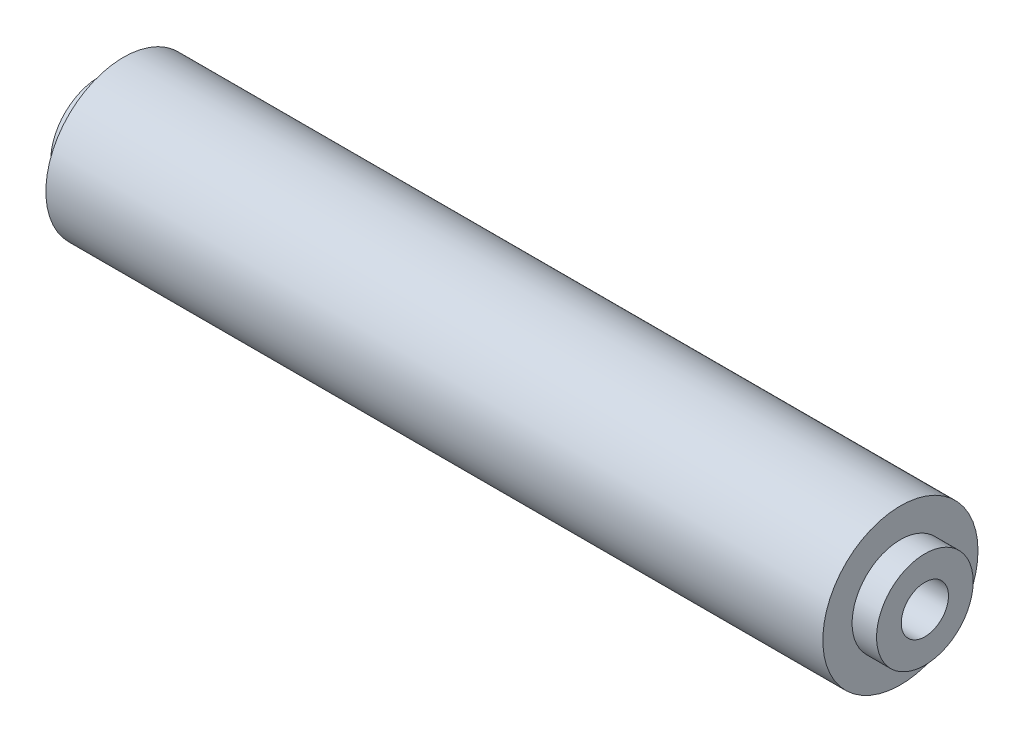
ISO-10303-21;
HEADER;
FILE_DESCRIPTION(('STEP AP214'),'2;1');
FILE_NAME('part.step','',(''),(''),'','','');
FILE_SCHEMA(('AUTOMOTIVE_DESIGN { 1 0 10303 214 1 1 1 1 }'));
ENDSEC;
DATA;
#1=APPLICATION_CONTEXT('core data for automotive mechanical design processes');
#2=APPLICATION_PROTOCOL_DEFINITION('international standard','automotive_design',2000,#1);
#3=PRODUCT_CONTEXT('',#1,'mechanical');
#4=PRODUCT('Part','Part','',(#3));
#5=PRODUCT_RELATED_PRODUCT_CATEGORY('part','',(#4));
#6=PRODUCT_DEFINITION_FORMATION('','',#4);
#7=PRODUCT_DEFINITION_CONTEXT('part definition',#1,'design');
#8=PRODUCT_DEFINITION('design','',#6,#7);
#9=PRODUCT_DEFINITION_SHAPE('','',#8);
#10=(LENGTH_UNIT() NAMED_UNIT(*) SI_UNIT(.MILLI.,.METRE.));
#11=(NAMED_UNIT(*) PLANE_ANGLE_UNIT() SI_UNIT($,.RADIAN.));
#12=(NAMED_UNIT(*) SI_UNIT($,.STERADIAN.) SOLID_ANGLE_UNIT());
#13=UNCERTAINTY_MEASURE_WITH_UNIT(LENGTH_MEASURE(1.E-05),#10,'distance_accuracy_value','');
#14=(GEOMETRIC_REPRESENTATION_CONTEXT(3) GLOBAL_UNCERTAINTY_ASSIGNED_CONTEXT((#13)) GLOBAL_UNIT_ASSIGNED_CONTEXT((#10,
#11,#12)) REPRESENTATION_CONTEXT('',''));
#15=CARTESIAN_POINT('',(0.,0.,0.));
#16=DIRECTION('',(0.,0.,1.));
#17=DIRECTION('',(1.,0.,0.));
#18=AXIS2_PLACEMENT_3D('',#15,#16,#17);
#19=CARTESIAN_POINT('',(0.,0.,0.));
#20=DIRECTION('',(1.,0.,0.));
#21=DIRECTION('',(0.,0.,-1.));
#22=AXIS2_PLACEMENT_3D('',#19,#20,#21);
#23=PLANE('',#22);
#24=CARTESIAN_POINT('',(0.,0.,0.));
#25=DIRECTION('',(1.,0.,0.));
#26=DIRECTION('',(0.,0.,-1.));
#27=AXIS2_PLACEMENT_3D('',#24,#25,#26);
#28=CIRCLE('',#27,9.3853);
#29=CARTESIAN_POINT('',(0.,0.,-9.3853));
#30=VERTEX_POINT('',#29);
#31=EDGE_CURVE('E35',#30,#30,#28,.T.);
#32=ORIENTED_EDGE('',*,*,#31,.F.);
#33=EDGE_LOOP('',(#32));
#34=FACE_BOUND('',#33,.T.);
#35=CARTESIAN_POINT('',(0.,0.,0.));
#36=DIRECTION('',(1.,0.,0.));
#37=DIRECTION('',(0.,0.,-1.));
#38=AXIS2_PLACEMENT_3D('',#35,#36,#37);
#39=CIRCLE('',#38,4.5847);
#40=CARTESIAN_POINT('',(0.,0.,-4.5847));
#41=VERTEX_POINT('',#40);
#42=EDGE_CURVE('E42',#41,#41,#39,.T.);
#43=ORIENTED_EDGE('',*,*,#42,.T.);
#44=EDGE_LOOP('',(#43));
#45=FACE_BOUND('',#44,.T.);
#46=ADVANCED_FACE('F31',(#34,#45),#23,.F.);
#47=CARTESIAN_POINT('',(4.7498,0.,0.));
#48=DIRECTION('',(-1.,0.,0.));
#49=DIRECTION('',(0.,0.,1.));
#50=AXIS2_PLACEMENT_3D('',#47,#48,#49);
#51=CYLINDRICAL_SURFACE('',#50,9.3853);
#52=CARTESIAN_POINT('',(4.7498,0.,0.));
#53=DIRECTION('',(1.,0.,0.));
#54=DIRECTION('',(0.,0.,-1.));
#55=AXIS2_PLACEMENT_3D('',#52,#53,#54);
#56=CIRCLE('',#55,9.3853);
#57=CARTESIAN_POINT('',(4.7498,0.,-9.3853));
#58=VERTEX_POINT('',#57);
#59=EDGE_CURVE('E10',#58,#58,#56,.T.);
#60=ORIENTED_EDGE('',*,*,#59,.F.);
#61=EDGE_LOOP('',(#60));
#62=FACE_BOUND('',#61,.T.);
#63=ORIENTED_EDGE('',*,*,#31,.T.);
#64=EDGE_LOOP('',(#63));
#65=FACE_BOUND('',#64,.T.);
#66=ADVANCED_FACE('F33',(#62,#65),#51,.T.);
#67=CARTESIAN_POINT('',(4.7498,0.,0.));
#68=DIRECTION('',(-1.,0.,0.));
#69=DIRECTION('',(0.,0.,1.));
#70=AXIS2_PLACEMENT_3D('',#67,#68,#69);
#71=CYLINDRICAL_SURFACE('',#70,4.5847);
#72=ORIENTED_EDGE('',*,*,#42,.F.);
#73=EDGE_LOOP('',(#72));
#74=FACE_BOUND('',#73,.T.);
#75=CARTESIAN_POINT('',(160.4658803,0.,0.));
#76=DIRECTION('',(1.,0.,0.));
#77=DIRECTION('',(0.,0.,-1.));
#78=AXIS2_PLACEMENT_3D('',#75,#76,#77);
#79=CIRCLE('',#78,4.5847);
#80=CARTESIAN_POINT('',(160.4658803,0.,-4.5847));
#81=VERTEX_POINT('',#80);
#82=EDGE_CURVE('E56',#81,#81,#79,.T.);
#83=ORIENTED_EDGE('',*,*,#82,.T.);
#84=EDGE_LOOP('',(#83));
#85=FACE_BOUND('',#84,.T.);
#86=ADVANCED_FACE('F62',(#74,#85),#71,.F.);
#87=CARTESIAN_POINT('',(80.23294015,0.,0.));
#88=DIRECTION('',(-1.,0.,0.));
#89=DIRECTION('',(0.,0.,1.));
#90=AXIS2_PLACEMENT_3D('',#87,#88,#89);
#91=CYLINDRICAL_SURFACE('',#90,15.07617);
#92=CARTESIAN_POINT('',(4.7498,0.,0.));
#93=DIRECTION('',(1.,0.,0.));
#94=DIRECTION('',(0.,0.,-1.));
#95=AXIS2_PLACEMENT_3D('',#92,#93,#94);
#96=CIRCLE('',#95,15.07617);
#97=CARTESIAN_POINT('',(4.7498,0.,-15.07617));
#98=VERTEX_POINT('',#97);
#99=EDGE_CURVE('E46',#98,#98,#96,.T.);
#100=ORIENTED_EDGE('',*,*,#99,.T.);
#101=EDGE_LOOP('',(#100));
#102=FACE_BOUND('',#101,.T.);
#103=CARTESIAN_POINT('',(155.7160803,0.,0.));
#104=DIRECTION('',(1.,0.,0.));
#105=DIRECTION('',(0.,0.,-1.));
#106=AXIS2_PLACEMENT_3D('',#103,#104,#105);
#107=CIRCLE('',#106,15.07617);
#108=CARTESIAN_POINT('',(155.7160803,0.,-15.07617));
#109=VERTEX_POINT('',#108);
#110=EDGE_CURVE('E49',#109,#109,#107,.T.);
#111=ORIENTED_EDGE('',*,*,#110,.F.);
#112=EDGE_LOOP('',(#111));
#113=FACE_BOUND('',#112,.T.);
#114=ADVANCED_FACE('F92',(#102,#113),#91,.T.);
#115=CARTESIAN_POINT('',(4.7498,0.,0.));
#116=DIRECTION('',(1.,0.,0.));
#117=DIRECTION('',(0.,0.,-1.));
#118=AXIS2_PLACEMENT_3D('',#115,#116,#117);
#119=PLANE('',#118);
#120=ORIENTED_EDGE('',*,*,#59,.T.);
#121=EDGE_LOOP('',(#120));
#122=FACE_BOUND('',#121,.T.);
#123=ORIENTED_EDGE('',*,*,#99,.F.);
#124=EDGE_LOOP('',(#123));
#125=FACE_BOUND('',#124,.T.);
#126=ADVANCED_FACE('F78',(#122,#125),#119,.F.);
#127=CARTESIAN_POINT('',(155.7160803,0.,0.));
#128=DIRECTION('',(-1.,0.,0.));
#129=DIRECTION('',(0.,0.,-1.));
#130=AXIS2_PLACEMENT_3D('',#127,#128,#129);
#131=PLANE('',#130);
#132=CARTESIAN_POINT('',(155.7160803,0.,0.));
#133=DIRECTION('',(1.,0.,0.));
#134=DIRECTION('',(0.,0.,-1.));
#135=AXIS2_PLACEMENT_3D('',#132,#133,#134);
#136=CIRCLE('',#135,9.3853);
#137=CARTESIAN_POINT('',(155.7160803,0.,-9.3853));
#138=VERTEX_POINT('',#137);
#139=EDGE_CURVE('E52',#138,#138,#136,.T.);
#140=ORIENTED_EDGE('',*,*,#139,.F.);
#141=EDGE_LOOP('',(#140));
#142=FACE_BOUND('',#141,.T.);
#143=ORIENTED_EDGE('',*,*,#110,.T.);
#144=EDGE_LOOP('',(#143));
#145=FACE_BOUND('',#144,.T.);
#146=ADVANCED_FACE('F72',(#142,#145),#131,.F.);
#147=CARTESIAN_POINT('',(155.7160803,0.,0.));
#148=DIRECTION('',(1.,0.,0.));
#149=DIRECTION('',(0.,0.,-1.));
#150=AXIS2_PLACEMENT_3D('',#147,#148,#149);
#151=CYLINDRICAL_SURFACE('',#150,9.3853);
#152=ORIENTED_EDGE('',*,*,#139,.T.);
#153=EDGE_LOOP('',(#152));
#154=FACE_BOUND('',#153,.T.);
#155=CARTESIAN_POINT('',(160.4658803,0.,0.));
#156=DIRECTION('',(1.,0.,0.));
#157=DIRECTION('',(0.,0.,-1.));
#158=AXIS2_PLACEMENT_3D('',#155,#156,#157);
#159=CIRCLE('',#158,9.3853);
#160=CARTESIAN_POINT('',(160.4658803,0.,-9.3853));
#161=VERTEX_POINT('',#160);
#162=EDGE_CURVE('E53',#161,#161,#159,.T.);
#163=ORIENTED_EDGE('',*,*,#162,.F.);
#164=EDGE_LOOP('',(#163));
#165=FACE_BOUND('',#164,.T.);
#166=ADVANCED_FACE('F67',(#154,#165),#151,.T.);
#167=CARTESIAN_POINT('',(160.4658803,0.,0.));
#168=DIRECTION('',(-1.,0.,0.));
#169=DIRECTION('',(0.,0.,-1.));
#170=AXIS2_PLACEMENT_3D('',#167,#168,#169);
#171=PLANE('',#170);
#172=ORIENTED_EDGE('',*,*,#82,.F.);
#173=EDGE_LOOP('',(#172));
#174=FACE_BOUND('',#173,.T.);
#175=ORIENTED_EDGE('',*,*,#162,.T.);
#176=EDGE_LOOP('',(#175));
#177=FACE_BOUND('',#176,.T.);
#178=ADVANCED_FACE('F64',(#174,#177),#171,.F.);
#179=CLOSED_SHELL('',(#46,#66,#86,#114,#126,#146,#166,#178));
#180=MANIFOLD_SOLID_BREP('B2',#179);
#181=ADVANCED_BREP_SHAPE_REPRESENTATION('',(#18,#180),#14);
#182=SHAPE_DEFINITION_REPRESENTATION(#9,#181);
ENDSEC;
END-ISO-10303-21;
